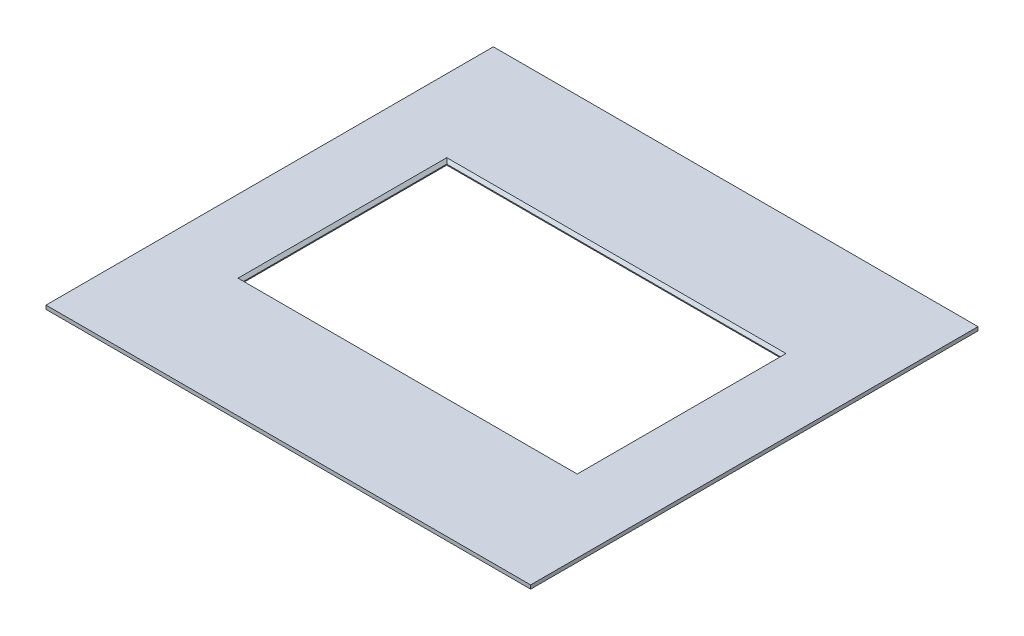
ISO-10303-21;
HEADER;
FILE_DESCRIPTION(('STEP AP214'),'2;1');
FILE_NAME('part.step','',(''),(''),'','','');
FILE_SCHEMA(('AUTOMOTIVE_DESIGN { 1 0 10303 214 1 1 1 1 }'));
ENDSEC;
DATA;
#1=APPLICATION_CONTEXT('core data for automotive mechanical design processes');
#2=APPLICATION_PROTOCOL_DEFINITION('international standard','automotive_design',2000,#1);
#3=PRODUCT_CONTEXT('',#1,'mechanical');
#4=PRODUCT('Part','Part','',(#3));
#5=PRODUCT_RELATED_PRODUCT_CATEGORY('part','',(#4));
#6=PRODUCT_DEFINITION_FORMATION('','',#4);
#7=PRODUCT_DEFINITION_CONTEXT('part definition',#1,'design');
#8=PRODUCT_DEFINITION('design','',#6,#7);
#9=PRODUCT_DEFINITION_SHAPE('','',#8);
#10=(LENGTH_UNIT() NAMED_UNIT(*) SI_UNIT(.MILLI.,.METRE.));
#11=(NAMED_UNIT(*) PLANE_ANGLE_UNIT() SI_UNIT($,.RADIAN.));
#12=(NAMED_UNIT(*) SI_UNIT($,.STERADIAN.) SOLID_ANGLE_UNIT());
#13=UNCERTAINTY_MEASURE_WITH_UNIT(LENGTH_MEASURE(1.E-05),#10,'distance_accuracy_value','');
#14=(GEOMETRIC_REPRESENTATION_CONTEXT(3) GLOBAL_UNCERTAINTY_ASSIGNED_CONTEXT((#13)) GLOBAL_UNIT_ASSIGNED_CONTEXT((#10,
#11,#12)) REPRESENTATION_CONTEXT('',''));
#15=CARTESIAN_POINT('',(0.,0.,0.));
#16=DIRECTION('',(0.,0.,1.));
#17=DIRECTION('',(1.,0.,0.));
#18=AXIS2_PLACEMENT_3D('',#15,#16,#17);
#19=CARTESIAN_POINT('',(0.,1.,0.));
#20=DIRECTION('',(0.,1.,0.));
#21=DIRECTION('',(0.,0.,1.));
#22=AXIS2_PLACEMENT_3D('',#19,#20,#21);
#23=PLANE('',#22);
#24=DIRECTION('',(0.,0.,1.));
#25=VECTOR('',#24,1.);
#26=CARTESIAN_POINT('',(45.5,1.,0.));
#27=LINE('',#26,#25);
#28=CARTESIAN_POINT('',(45.5,1.,-28.));
#29=VERTEX_POINT('',#28);
#30=CARTESIAN_POINT('',(45.5,1.,28.));
#31=VERTEX_POINT('',#30);
#32=EDGE_CURVE('E212',#29,#31,#27,.T.);
#33=ORIENTED_EDGE('',*,*,#32,.T.);
#34=DIRECTION('',(-1.,0.,0.));
#35=VECTOR('',#34,1.);
#36=CARTESIAN_POINT('',(0.,1.,28.));
#37=LINE('',#36,#35);
#38=CARTESIAN_POINT('',(-45.5,1.,28.));
#39=VERTEX_POINT('',#38);
#40=EDGE_CURVE('E215',#31,#39,#37,.T.);
#41=ORIENTED_EDGE('',*,*,#40,.T.);
#42=DIRECTION('',(0.,0.,-1.));
#43=VECTOR('',#42,1.);
#44=CARTESIAN_POINT('',(-45.5,1.,0.));
#45=LINE('',#44,#43);
#46=CARTESIAN_POINT('',(-45.5,1.,-28.));
#47=VERTEX_POINT('',#46);
#48=EDGE_CURVE('E206',#39,#47,#45,.T.);
#49=ORIENTED_EDGE('',*,*,#48,.T.);
#50=DIRECTION('',(1.,0.,0.));
#51=VECTOR('',#50,1.);
#52=CARTESIAN_POINT('',(0.,1.,-28.));
#53=LINE('',#52,#51);
#54=EDGE_CURVE('E209',#47,#29,#53,.T.);
#55=ORIENTED_EDGE('',*,*,#54,.T.);
#56=EDGE_LOOP('',(#33,#41,#49,#55));
#57=FACE_BOUND('',#56,.T.);
#58=DIRECTION('',(0.,0.,-1.));
#59=VECTOR('',#58,1.);
#60=CARTESIAN_POINT('',(65.,1.,-60.));
#61=LINE('',#60,#59);
#62=CARTESIAN_POINT('',(65.,1.,60.));
#63=VERTEX_POINT('',#62);
#64=CARTESIAN_POINT('',(65.,1.,-60.));
#65=VERTEX_POINT('',#64);
#66=EDGE_CURVE('E161',#63,#65,#61,.T.);
#67=ORIENTED_EDGE('',*,*,#66,.T.);
#68=DIRECTION('',(-1.,0.,0.));
#69=VECTOR('',#68,1.);
#70=CARTESIAN_POINT('',(-65.,1.,-60.));
#71=LINE('',#70,#69);
#72=CARTESIAN_POINT('',(-65.,1.,-60.));
#73=VERTEX_POINT('',#72);
#74=EDGE_CURVE('E165',#65,#73,#71,.T.);
#75=ORIENTED_EDGE('',*,*,#74,.T.);
#76=DIRECTION('',(0.,0.,1.));
#77=VECTOR('',#76,1.);
#78=CARTESIAN_POINT('',(-65.,1.,-60.));
#79=LINE('',#78,#77);
#80=CARTESIAN_POINT('',(-65.,1.,60.));
#81=VERTEX_POINT('',#80);
#82=EDGE_CURVE('E169',#73,#81,#79,.T.);
#83=ORIENTED_EDGE('',*,*,#82,.T.);
#84=DIRECTION('',(1.,0.,0.));
#85=VECTOR('',#84,1.);
#86=CARTESIAN_POINT('',(-65.,1.,60.));
#87=LINE('',#86,#85);
#88=EDGE_CURVE('E172',#81,#63,#87,.T.);
#89=ORIENTED_EDGE('',*,*,#88,.T.);
#90=EDGE_LOOP('',(#67,#75,#83,#89));
#91=FACE_BOUND('',#90,.T.);
#92=ADVANCED_FACE('F43',(#57,#91),#23,.T.);
#93=CARTESIAN_POINT('',(0.,0.,0.));
#94=DIRECTION('',(0.,1.,0.));
#95=DIRECTION('',(0.,0.,1.));
#96=AXIS2_PLACEMENT_3D('',#93,#94,#95);
#97=PLANE('',#96);
#98=DIRECTION('',(0.,0.,-1.));
#99=VECTOR('',#98,1.);
#100=CARTESIAN_POINT('',(65.,0.,-60.));
#101=LINE('',#100,#99);
#102=CARTESIAN_POINT('',(65.,0.,60.));
#103=VERTEX_POINT('',#102);
#104=CARTESIAN_POINT('',(65.,0.,-60.));
#105=VERTEX_POINT('',#104);
#106=EDGE_CURVE('E128',#103,#105,#101,.T.);
#107=ORIENTED_EDGE('',*,*,#106,.F.);
#108=DIRECTION('',(1.,0.,0.));
#109=VECTOR('',#108,1.);
#110=CARTESIAN_POINT('',(-65.,0.,60.));
#111=LINE('',#110,#109);
#112=CARTESIAN_POINT('',(-65.,0.,60.));
#113=VERTEX_POINT('',#112);
#114=EDGE_CURVE('E166',#113,#103,#111,.T.);
#115=ORIENTED_EDGE('',*,*,#114,.F.);
#116=DIRECTION('',(0.,0.,1.));
#117=VECTOR('',#116,1.);
#118=CARTESIAN_POINT('',(-65.,0.,-60.));
#119=LINE('',#118,#117);
#120=CARTESIAN_POINT('',(-65.,0.,-60.));
#121=VERTEX_POINT('',#120);
#122=EDGE_CURVE('E182',#121,#113,#119,.T.);
#123=ORIENTED_EDGE('',*,*,#122,.F.);
#124=DIRECTION('',(-1.,0.,0.));
#125=VECTOR('',#124,1.);
#126=CARTESIAN_POINT('',(-65.,0.,-60.));
#127=LINE('',#126,#125);
#128=EDGE_CURVE('E179',#105,#121,#127,.T.);
#129=ORIENTED_EDGE('',*,*,#128,.F.);
#130=EDGE_LOOP('',(#107,#115,#123,#129));
#131=FACE_BOUND('',#130,.T.);
#132=DIRECTION('',(0.,0.,-1.));
#133=VECTOR('',#132,1.);
#134=CARTESIAN_POINT('',(44.75,0.,-27.25));
#135=LINE('',#134,#133);
#136=CARTESIAN_POINT('',(44.75,0.,27.25));
#137=VERTEX_POINT('',#136);
#138=CARTESIAN_POINT('',(44.75,0.,-27.25));
#139=VERTEX_POINT('',#138);
#140=EDGE_CURVE('E125',#137,#139,#135,.T.);
#141=ORIENTED_EDGE('',*,*,#140,.T.);
#142=DIRECTION('',(-1.,0.,0.));
#143=VECTOR('',#142,1.);
#144=CARTESIAN_POINT('',(-44.75,0.,-27.25));
#145=LINE('',#144,#143);
#146=CARTESIAN_POINT('',(-44.75,0.,-27.25));
#147=VERTEX_POINT('',#146);
#148=EDGE_CURVE('E132',#139,#147,#145,.T.);
#149=ORIENTED_EDGE('',*,*,#148,.T.);
#150=DIRECTION('',(0.,0.,1.));
#151=VECTOR('',#150,1.);
#152=CARTESIAN_POINT('',(-44.75,0.,-27.25));
#153=LINE('',#152,#151);
#154=CARTESIAN_POINT('',(-44.75,0.,27.25));
#155=VERTEX_POINT('',#154);
#156=EDGE_CURVE('E138',#147,#155,#153,.T.);
#157=ORIENTED_EDGE('',*,*,#156,.T.);
#158=DIRECTION('',(1.,0.,0.));
#159=VECTOR('',#158,1.);
#160=CARTESIAN_POINT('',(-44.75,0.,27.25));
#161=LINE('',#160,#159);
#162=EDGE_CURVE('E142',#155,#137,#161,.T.);
#163=ORIENTED_EDGE('',*,*,#162,.T.);
#164=EDGE_LOOP('',(#141,#149,#157,#163));
#165=FACE_BOUND('',#164,.T.);
#166=ADVANCED_FACE('F140',(#131,#165),#97,.F.);
#167=CARTESIAN_POINT('',(65.,1.,-60.));
#168=DIRECTION('',(-1.,0.,0.));
#169=DIRECTION('',(0.,0.,1.));
#170=AXIS2_PLACEMENT_3D('',#167,#168,#169);
#171=PLANE('',#170);
#172=ORIENTED_EDGE('',*,*,#106,.T.);
#173=DIRECTION('',(0.,-1.,0.));
#174=VECTOR('',#173,1.);
#175=CARTESIAN_POINT('',(65.,1.,-60.));
#176=LINE('',#175,#174);
#177=EDGE_CURVE('E198',#65,#105,#176,.T.);
#178=ORIENTED_EDGE('',*,*,#177,.F.);
#179=ORIENTED_EDGE('',*,*,#66,.F.);
#180=DIRECTION('',(0.,-1.,0.));
#181=VECTOR('',#180,1.);
#182=CARTESIAN_POINT('',(65.,1.,60.));
#183=LINE('',#182,#181);
#184=EDGE_CURVE('E175',#63,#103,#183,.T.);
#185=ORIENTED_EDGE('',*,*,#184,.T.);
#186=EDGE_LOOP('',(#172,#178,#179,#185));
#187=FACE_BOUND('',#186,.T.);
#188=ADVANCED_FACE('F262',(#187),#171,.F.);
#189=CARTESIAN_POINT('',(-65.,1.,-60.));
#190=DIRECTION('',(0.,0.,1.));
#191=DIRECTION('',(1.,0.,0.));
#192=AXIS2_PLACEMENT_3D('',#189,#190,#191);
#193=PLANE('',#192);
#194=ORIENTED_EDGE('',*,*,#128,.T.);
#195=DIRECTION('',(0.,-1.,0.));
#196=VECTOR('',#195,1.);
#197=CARTESIAN_POINT('',(-65.,1.,-60.));
#198=LINE('',#197,#196);
#199=EDGE_CURVE('E194',#73,#121,#198,.T.);
#200=ORIENTED_EDGE('',*,*,#199,.F.);
#201=ORIENTED_EDGE('',*,*,#74,.F.);
#202=ORIENTED_EDGE('',*,*,#177,.T.);
#203=EDGE_LOOP('',(#194,#200,#201,#202));
#204=FACE_BOUND('',#203,.T.);
#205=ADVANCED_FACE('F265',(#204),#193,.F.);
#206=CARTESIAN_POINT('',(-65.,1.,-60.));
#207=DIRECTION('',(1.,0.,0.));
#208=DIRECTION('',(0.,0.,-1.));
#209=AXIS2_PLACEMENT_3D('',#206,#207,#208);
#210=PLANE('',#209);
#211=ORIENTED_EDGE('',*,*,#122,.T.);
#212=DIRECTION('',(0.,-1.,0.));
#213=VECTOR('',#212,1.);
#214=CARTESIAN_POINT('',(-65.,1.,60.));
#215=LINE('',#214,#213);
#216=EDGE_CURVE('E190',#81,#113,#215,.T.);
#217=ORIENTED_EDGE('',*,*,#216,.F.);
#218=ORIENTED_EDGE('',*,*,#82,.F.);
#219=ORIENTED_EDGE('',*,*,#199,.T.);
#220=EDGE_LOOP('',(#211,#217,#218,#219));
#221=FACE_BOUND('',#220,.T.);
#222=ADVANCED_FACE('F270',(#221),#210,.F.);
#223=CARTESIAN_POINT('',(-65.,1.,60.));
#224=DIRECTION('',(0.,0.,-1.));
#225=DIRECTION('',(-1.,0.,0.));
#226=AXIS2_PLACEMENT_3D('',#223,#224,#225);
#227=PLANE('',#226);
#228=ORIENTED_EDGE('',*,*,#114,.T.);
#229=ORIENTED_EDGE('',*,*,#184,.F.);
#230=ORIENTED_EDGE('',*,*,#88,.F.);
#231=ORIENTED_EDGE('',*,*,#216,.T.);
#232=EDGE_LOOP('',(#228,#229,#230,#231));
#233=FACE_BOUND('',#232,.T.);
#234=ADVANCED_FACE('F273',(#233),#227,.F.);
#235=CARTESIAN_POINT('',(44.75,1.,-27.25));
#236=DIRECTION('',(-1.,0.,0.));
#237=DIRECTION('',(0.,0.,1.));
#238=AXIS2_PLACEMENT_3D('',#235,#236,#237);
#239=PLANE('',#238);
#240=DIRECTION('',(0.,-1.,0.));
#241=VECTOR('',#240,1.);
#242=CARTESIAN_POINT('',(44.75,1.,27.25));
#243=LINE('',#242,#241);
#244=CARTESIAN_POINT('',(44.75,0.250000000000027,27.25));
#245=VERTEX_POINT('',#244);
#246=EDGE_CURVE('E153',#245,#137,#243,.T.);
#247=ORIENTED_EDGE('',*,*,#246,.F.);
#248=DIRECTION('',(0.,0.,-1.));
#249=VECTOR('',#248,1.);
#250=CARTESIAN_POINT('',(44.75,0.250000000000027,-27.25));
#251=LINE('',#250,#249);
#252=CARTESIAN_POINT('',(44.75,0.250000000000027,-27.25));
#253=VERTEX_POINT('',#252);
#254=EDGE_CURVE('E69',#245,#253,#251,.T.);
#255=ORIENTED_EDGE('',*,*,#254,.T.);
#256=DIRECTION('',(0.,-1.,0.));
#257=VECTOR('',#256,1.);
#258=CARTESIAN_POINT('',(44.75,1.,-27.25));
#259=LINE('',#258,#257);
#260=EDGE_CURVE('E121',#253,#139,#259,.T.);
#261=ORIENTED_EDGE('',*,*,#260,.T.);
#262=ORIENTED_EDGE('',*,*,#140,.F.);
#263=EDGE_LOOP('',(#247,#255,#261,#262));
#264=FACE_BOUND('',#263,.T.);
#265=ADVANCED_FACE('F123',(#264),#239,.T.);
#266=CARTESIAN_POINT('',(-44.75,1.,-27.25));
#267=DIRECTION('',(0.,0.,1.));
#268=DIRECTION('',(1.,0.,0.));
#269=AXIS2_PLACEMENT_3D('',#266,#267,#268);
#270=PLANE('',#269);
#271=ORIENTED_EDGE('',*,*,#260,.F.);
#272=DIRECTION('',(-1.,0.,0.));
#273=VECTOR('',#272,1.);
#274=CARTESIAN_POINT('',(-44.75,0.250000000000027,-27.25));
#275=LINE('',#274,#273);
#276=CARTESIAN_POINT('',(-44.75,0.250000000000027,-27.25));
#277=VERTEX_POINT('',#276);
#278=EDGE_CURVE('E54',#253,#277,#275,.T.);
#279=ORIENTED_EDGE('',*,*,#278,.T.);
#280=DIRECTION('',(0.,-1.,0.));
#281=VECTOR('',#280,1.);
#282=CARTESIAN_POINT('',(-44.75,1.,-27.25));
#283=LINE('',#282,#281);
#284=EDGE_CURVE('E129',#277,#147,#283,.T.);
#285=ORIENTED_EDGE('',*,*,#284,.T.);
#286=ORIENTED_EDGE('',*,*,#148,.F.);
#287=EDGE_LOOP('',(#271,#279,#285,#286));
#288=FACE_BOUND('',#287,.T.);
#289=ADVANCED_FACE('F133',(#288),#270,.T.);
#290=CARTESIAN_POINT('',(-44.75,1.,-27.25));
#291=DIRECTION('',(1.,0.,0.));
#292=DIRECTION('',(0.,0.,-1.));
#293=AXIS2_PLACEMENT_3D('',#290,#291,#292);
#294=PLANE('',#293);
#295=ORIENTED_EDGE('',*,*,#284,.F.);
#296=DIRECTION('',(0.,0.,1.));
#297=VECTOR('',#296,1.);
#298=CARTESIAN_POINT('',(-44.75,0.250000000000027,-27.25));
#299=LINE('',#298,#297);
#300=CARTESIAN_POINT('',(-44.75,0.250000000000027,27.25));
#301=VERTEX_POINT('',#300);
#302=EDGE_CURVE('E11',#277,#301,#299,.T.);
#303=ORIENTED_EDGE('',*,*,#302,.T.);
#304=DIRECTION('',(0.,-1.,0.));
#305=VECTOR('',#304,1.);
#306=CARTESIAN_POINT('',(-44.75,1.,27.25));
#307=LINE('',#306,#305);
#308=EDGE_CURVE('E156',#301,#155,#307,.T.);
#309=ORIENTED_EDGE('',*,*,#308,.T.);
#310=ORIENTED_EDGE('',*,*,#156,.F.);
#311=EDGE_LOOP('',(#295,#303,#309,#310));
#312=FACE_BOUND('',#311,.T.);
#313=ADVANCED_FACE('F246',(#312),#294,.T.);
#314=CARTESIAN_POINT('',(-44.75,1.,27.25));
#315=DIRECTION('',(0.,0.,-1.));
#316=DIRECTION('',(-1.,0.,0.));
#317=AXIS2_PLACEMENT_3D('',#314,#315,#316);
#318=PLANE('',#317);
#319=ORIENTED_EDGE('',*,*,#308,.F.);
#320=DIRECTION('',(1.,0.,0.));
#321=VECTOR('',#320,1.);
#322=CARTESIAN_POINT('',(-44.75,0.250000000000027,27.25));
#323=LINE('',#322,#321);
#324=EDGE_CURVE('E202',#301,#245,#323,.T.);
#325=ORIENTED_EDGE('',*,*,#324,.T.);
#326=ORIENTED_EDGE('',*,*,#246,.T.);
#327=ORIENTED_EDGE('',*,*,#162,.F.);
#328=EDGE_LOOP('',(#319,#325,#326,#327));
#329=FACE_BOUND('',#328,.T.);
#330=ADVANCED_FACE('F248',(#329),#318,.T.);
#331=CARTESIAN_POINT('',(-44.75,0.250000000000027,-27.25));
#332=DIRECTION('',(0.,-0.707106781186561,-0.707106781186534));
#333=DIRECTION('',(-1.,0.,0.));
#334=AXIS2_PLACEMENT_3D('',#331,#332,#333);
#335=PLANE('',#334);
#336=DIRECTION('',(0.577350269189635,0.577350269189611,-0.577350269189632));
#337=VECTOR('',#336,1.);
#338=CARTESIAN_POINT('',(44.75,0.250000000000027,-27.25));
#339=LINE('',#338,#337);
#340=EDGE_CURVE('E147',#29,#253,#339,.F.);
#341=ORIENTED_EDGE('',*,*,#340,.F.);
#342=ORIENTED_EDGE('',*,*,#54,.F.);
#343=DIRECTION('',(-0.577350269189633,0.577350269189611,-0.577350269189633));
#344=VECTOR('',#343,1.);
#345=CARTESIAN_POINT('',(-44.75,0.250000000000027,-27.25));
#346=LINE('',#345,#344);
#347=EDGE_CURVE('E48',#277,#47,#346,.T.);
#348=ORIENTED_EDGE('',*,*,#347,.F.);
#349=ORIENTED_EDGE('',*,*,#278,.F.);
#350=EDGE_LOOP('',(#341,#342,#348,#349));
#351=FACE_BOUND('',#350,.T.);
#352=ADVANCED_FACE('F46',(#351),#335,.F.);
#353=CARTESIAN_POINT('',(-44.75,0.250000000000027,-27.25));
#354=DIRECTION('',(-0.707106781186534,-0.707106781186561,0.));
#355=DIRECTION('',(0.,0.,1.));
#356=AXIS2_PLACEMENT_3D('',#353,#354,#355);
#357=PLANE('',#356);
#358=ORIENTED_EDGE('',*,*,#347,.T.);
#359=ORIENTED_EDGE('',*,*,#48,.F.);
#360=DIRECTION('',(0.577350269189633,-0.577350269189612,-0.577350269189633));
#361=VECTOR('',#360,1.);
#362=CARTESIAN_POINT('',(-44.75,0.250000000000027,27.25));
#363=LINE('',#362,#361);
#364=EDGE_CURVE('E226',#301,#39,#363,.F.);
#365=ORIENTED_EDGE('',*,*,#364,.F.);
#366=ORIENTED_EDGE('',*,*,#302,.F.);
#367=EDGE_LOOP('',(#358,#359,#365,#366));
#368=FACE_BOUND('',#367,.T.);
#369=ADVANCED_FACE('F242',(#368),#357,.F.);
#370=CARTESIAN_POINT('',(44.75,0.250000000000027,-27.25));
#371=DIRECTION('',(0.707106781186533,-0.707106781186562,0.));
#372=DIRECTION('',(0.,0.,-1.));
#373=AXIS2_PLACEMENT_3D('',#370,#371,#372);
#374=PLANE('',#373);
#375=ORIENTED_EDGE('',*,*,#340,.T.);
#376=ORIENTED_EDGE('',*,*,#254,.F.);
#377=DIRECTION('',(0.577350269189635,0.577350269189611,0.577350269189632));
#378=VECTOR('',#377,1.);
#379=CARTESIAN_POINT('',(14.9166666666657,-29.583333333333,-2.58333333333412));
#380=LINE('',#379,#378);
#381=EDGE_CURVE('E223',#31,#245,#380,.F.);
#382=ORIENTED_EDGE('',*,*,#381,.F.);
#383=ORIENTED_EDGE('',*,*,#32,.F.);
#384=EDGE_LOOP('',(#375,#376,#382,#383));
#385=FACE_BOUND('',#384,.T.);
#386=ADVANCED_FACE('F233',(#385),#374,.F.);
#387=CARTESIAN_POINT('',(-44.75,0.250000000000027,27.25));
#388=DIRECTION('',(0.,-0.707106781186561,0.707106781186534));
#389=DIRECTION('',(1.,0.,0.));
#390=AXIS2_PLACEMENT_3D('',#387,#388,#389);
#391=PLANE('',#390);
#392=ORIENTED_EDGE('',*,*,#364,.T.);
#393=ORIENTED_EDGE('',*,*,#40,.F.);
#394=ORIENTED_EDGE('',*,*,#381,.T.);
#395=ORIENTED_EDGE('',*,*,#324,.F.);
#396=EDGE_LOOP('',(#392,#393,#394,#395));
#397=FACE_BOUND('',#396,.T.);
#398=ADVANCED_FACE('F250',(#397),#391,.F.);
#399=CLOSED_SHELL('',(#92,#166,#188,#205,#222,#234,#265,#289,#313,#330,#352,#369,#386,#398));
#400=MANIFOLD_SOLID_BREP('B2',#399);
#401=ADVANCED_BREP_SHAPE_REPRESENTATION('',(#18,#400),#14);
#402=SHAPE_DEFINITION_REPRESENTATION(#9,#401);
ENDSEC;
END-ISO-10303-21;
